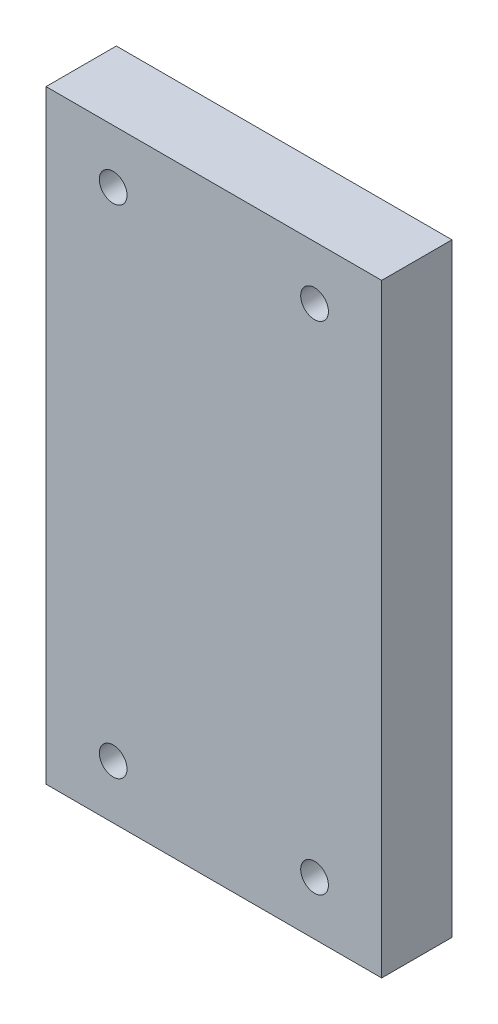
ISO-10303-21;
HEADER;
FILE_DESCRIPTION(('STEP AP214'),'2;1');
FILE_NAME('part.step','',(''),(''),'','','');
FILE_SCHEMA(('AUTOMOTIVE_DESIGN { 1 0 10303 214 1 1 1 1 }'));
ENDSEC;
DATA;
#1=APPLICATION_CONTEXT('core data for automotive mechanical design processes');
#2=APPLICATION_PROTOCOL_DEFINITION('international standard','automotive_design',2000,#1);
#3=PRODUCT_CONTEXT('',#1,'mechanical');
#4=PRODUCT('Part','Part','',(#3));
#5=PRODUCT_RELATED_PRODUCT_CATEGORY('part','',(#4));
#6=PRODUCT_DEFINITION_FORMATION('','',#4);
#7=PRODUCT_DEFINITION_CONTEXT('part definition',#1,'design');
#8=PRODUCT_DEFINITION('design','',#6,#7);
#9=PRODUCT_DEFINITION_SHAPE('','',#8);
#10=(LENGTH_UNIT() NAMED_UNIT(*) SI_UNIT(.MILLI.,.METRE.));
#11=(NAMED_UNIT(*) PLANE_ANGLE_UNIT() SI_UNIT($,.RADIAN.));
#12=(NAMED_UNIT(*) SI_UNIT($,.STERADIAN.) SOLID_ANGLE_UNIT());
#13=UNCERTAINTY_MEASURE_WITH_UNIT(LENGTH_MEASURE(1.E-05),#10,'distance_accuracy_value','');
#14=(GEOMETRIC_REPRESENTATION_CONTEXT(3) GLOBAL_UNCERTAINTY_ASSIGNED_CONTEXT((#13)) GLOBAL_UNIT_ASSIGNED_CONTEXT((#10,
#11,#12)) REPRESENTATION_CONTEXT('',''));
#15=CARTESIAN_POINT('',(0.,0.,0.));
#16=DIRECTION('',(0.,0.,1.));
#17=DIRECTION('',(1.,0.,0.));
#18=AXIS2_PLACEMENT_3D('',#15,#16,#17);
#19=CARTESIAN_POINT('',(0.,90.,10.47));
#20=DIRECTION('',(0.,0.,-1.));
#21=DIRECTION('',(-1.,0.,0.));
#22=AXIS2_PLACEMENT_3D('',#19,#20,#21);
#23=PLANE('',#22);
#24=CARTESIAN_POINT('',(40.,81.9999999999998,10.47));
#25=DIRECTION('',(0.,0.,1.));
#26=DIRECTION('',(1.,0.,0.));
#27=AXIS2_PLACEMENT_3D('',#24,#25,#26);
#28=CIRCLE('',#27,2.065);
#29=CARTESIAN_POINT('',(42.065,81.9999999999998,10.47));
#30=VERTEX_POINT('',#29);
#31=EDGE_CURVE('E123',#30,#30,#28,.T.);
#32=ORIENTED_EDGE('',*,*,#31,.F.);
#33=EDGE_LOOP('',(#32));
#34=FACE_BOUND('',#33,.T.);
#35=CARTESIAN_POINT('',(40.,8.,10.47));
#36=DIRECTION('',(0.,0.,1.));
#37=DIRECTION('',(1.,0.,0.));
#38=AXIS2_PLACEMENT_3D('',#35,#36,#37);
#39=CIRCLE('',#38,2.065);
#40=CARTESIAN_POINT('',(42.065,8.,10.47));
#41=VERTEX_POINT('',#40);
#42=EDGE_CURVE('E102',#41,#41,#39,.T.);
#43=ORIENTED_EDGE('',*,*,#42,.F.);
#44=EDGE_LOOP('',(#43));
#45=FACE_BOUND('',#44,.T.);
#46=DIRECTION('',(0.,-1.,0.));
#47=VECTOR('',#46,1.);
#48=CARTESIAN_POINT('',(0.,0.,10.47));
#49=LINE('',#48,#47);
#50=CARTESIAN_POINT('',(0.,90.,10.47));
#51=VERTEX_POINT('',#50);
#52=CARTESIAN_POINT('',(0.,0.,10.47));
#53=VERTEX_POINT('',#52);
#54=EDGE_CURVE('E87',#51,#53,#49,.T.);
#55=ORIENTED_EDGE('',*,*,#54,.T.);
#56=DIRECTION('',(1.,0.,0.));
#57=VECTOR('',#56,1.);
#58=CARTESIAN_POINT('',(0.,0.,10.47));
#59=LINE('',#58,#57);
#60=CARTESIAN_POINT('',(50.,0.,10.47));
#61=VERTEX_POINT('',#60);
#62=EDGE_CURVE('E82',#53,#61,#59,.T.);
#63=ORIENTED_EDGE('',*,*,#62,.T.);
#64=DIRECTION('',(0.,1.,0.));
#65=VECTOR('',#64,1.);
#66=CARTESIAN_POINT('',(50.,0.,10.47));
#67=LINE('',#66,#65);
#68=CARTESIAN_POINT('',(50.,90.,10.47));
#69=VERTEX_POINT('',#68);
#70=EDGE_CURVE('E85',#61,#69,#67,.T.);
#71=ORIENTED_EDGE('',*,*,#70,.T.);
#72=DIRECTION('',(-1.,0.,0.));
#73=VECTOR('',#72,1.);
#74=CARTESIAN_POINT('',(0.,90.,10.47));
#75=LINE('',#74,#73);
#76=EDGE_CURVE('E52',#69,#51,#75,.T.);
#77=ORIENTED_EDGE('',*,*,#76,.T.);
#78=EDGE_LOOP('',(#55,#63,#71,#77));
#79=FACE_BOUND('',#78,.T.);
#80=CARTESIAN_POINT('',(10.,8.,10.47));
#81=DIRECTION('',(0.,0.,1.));
#82=DIRECTION('',(1.,0.,0.));
#83=AXIS2_PLACEMENT_3D('',#80,#81,#82);
#84=CIRCLE('',#83,2.065);
#85=CARTESIAN_POINT('',(12.065,8.,10.47));
#86=VERTEX_POINT('',#85);
#87=EDGE_CURVE('E117',#86,#86,#84,.T.);
#88=ORIENTED_EDGE('',*,*,#87,.F.);
#89=EDGE_LOOP('',(#88));
#90=FACE_BOUND('',#89,.T.);
#91=CARTESIAN_POINT('',(10.,81.9999999999998,10.47));
#92=DIRECTION('',(0.,0.,1.));
#93=DIRECTION('',(1.,0.,0.));
#94=AXIS2_PLACEMENT_3D('',#91,#92,#93);
#95=CIRCLE('',#94,2.065);
#96=CARTESIAN_POINT('',(12.065,81.9999999999998,10.47));
#97=VERTEX_POINT('',#96);
#98=EDGE_CURVE('E129',#97,#97,#95,.T.);
#99=ORIENTED_EDGE('',*,*,#98,.F.);
#100=EDGE_LOOP('',(#99));
#101=FACE_BOUND('',#100,.T.);
#102=ADVANCED_FACE('F35',(#34,#45,#79,#90,#101),#23,.F.);
#103=CARTESIAN_POINT('',(0.,90.,0.));
#104=DIRECTION('',(0.,0.,-1.));
#105=DIRECTION('',(-1.,0.,0.));
#106=AXIS2_PLACEMENT_3D('',#103,#104,#105);
#107=PLANE('',#106);
#108=CARTESIAN_POINT('',(40.,81.9999999999998,0.));
#109=DIRECTION('',(0.,0.,1.));
#110=DIRECTION('',(1.,0.,0.));
#111=AXIS2_PLACEMENT_3D('',#108,#109,#110);
#112=CIRCLE('',#111,2.065);
#113=CARTESIAN_POINT('',(42.065,81.9999999999998,0.));
#114=VERTEX_POINT('',#113);
#115=EDGE_CURVE('E126',#114,#114,#112,.T.);
#116=ORIENTED_EDGE('',*,*,#115,.T.);
#117=EDGE_LOOP('',(#116));
#118=FACE_BOUND('',#117,.T.);
#119=CARTESIAN_POINT('',(40.,8.,0.));
#120=DIRECTION('',(0.,0.,1.));
#121=DIRECTION('',(1.,0.,0.));
#122=AXIS2_PLACEMENT_3D('',#119,#120,#121);
#123=CIRCLE('',#122,2.065);
#124=CARTESIAN_POINT('',(42.065,8.,0.));
#125=VERTEX_POINT('',#124);
#126=EDGE_CURVE('E114',#125,#125,#123,.T.);
#127=ORIENTED_EDGE('',*,*,#126,.T.);
#128=EDGE_LOOP('',(#127));
#129=FACE_BOUND('',#128,.T.);
#130=DIRECTION('',(0.,-1.,0.));
#131=VECTOR('',#130,1.);
#132=CARTESIAN_POINT('',(0.,0.,0.));
#133=LINE('',#132,#131);
#134=CARTESIAN_POINT('',(0.,90.,0.));
#135=VERTEX_POINT('',#134);
#136=CARTESIAN_POINT('',(0.,0.,0.));
#137=VERTEX_POINT('',#136);
#138=EDGE_CURVE('E99',#135,#137,#133,.T.);
#139=ORIENTED_EDGE('',*,*,#138,.F.);
#140=DIRECTION('',(-1.,0.,0.));
#141=VECTOR('',#140,1.);
#142=CARTESIAN_POINT('',(0.,90.,0.));
#143=LINE('',#142,#141);
#144=CARTESIAN_POINT('',(50.,90.,0.));
#145=VERTEX_POINT('',#144);
#146=EDGE_CURVE('E75',#145,#135,#143,.T.);
#147=ORIENTED_EDGE('',*,*,#146,.F.);
#148=DIRECTION('',(0.,1.,0.));
#149=VECTOR('',#148,1.);
#150=CARTESIAN_POINT('',(50.,0.,0.));
#151=LINE('',#150,#149);
#152=CARTESIAN_POINT('',(50.,0.,0.));
#153=VERTEX_POINT('',#152);
#154=EDGE_CURVE('E69',#153,#145,#151,.T.);
#155=ORIENTED_EDGE('',*,*,#154,.F.);
#156=DIRECTION('',(1.,0.,0.));
#157=VECTOR('',#156,1.);
#158=CARTESIAN_POINT('',(0.,0.,0.));
#159=LINE('',#158,#157);
#160=EDGE_CURVE('E91',#137,#153,#159,.T.);
#161=ORIENTED_EDGE('',*,*,#160,.F.);
#162=EDGE_LOOP('',(#139,#147,#155,#161));
#163=FACE_BOUND('',#162,.T.);
#164=CARTESIAN_POINT('',(10.,8.,0.));
#165=DIRECTION('',(0.,0.,1.));
#166=DIRECTION('',(1.,0.,0.));
#167=AXIS2_PLACEMENT_3D('',#164,#165,#166);
#168=CIRCLE('',#167,2.065);
#169=CARTESIAN_POINT('',(12.065,8.,0.));
#170=VERTEX_POINT('',#169);
#171=EDGE_CURVE('E120',#170,#170,#168,.T.);
#172=ORIENTED_EDGE('',*,*,#171,.T.);
#173=EDGE_LOOP('',(#172));
#174=FACE_BOUND('',#173,.T.);
#175=CARTESIAN_POINT('',(10.,81.9999999999998,0.));
#176=DIRECTION('',(0.,0.,1.));
#177=DIRECTION('',(1.,0.,0.));
#178=AXIS2_PLACEMENT_3D('',#175,#176,#177);
#179=CIRCLE('',#178,2.065);
#180=CARTESIAN_POINT('',(12.065,81.9999999999998,0.));
#181=VERTEX_POINT('',#180);
#182=EDGE_CURVE('E132',#181,#181,#179,.T.);
#183=ORIENTED_EDGE('',*,*,#182,.T.);
#184=EDGE_LOOP('',(#183));
#185=FACE_BOUND('',#184,.T.);
#186=ADVANCED_FACE('F110',(#118,#129,#163,#174,#185),#107,.T.);
#187=CARTESIAN_POINT('',(0.,0.,10.47));
#188=DIRECTION('',(1.,0.,0.));
#189=DIRECTION('',(0.,0.,-1.));
#190=AXIS2_PLACEMENT_3D('',#187,#188,#189);
#191=PLANE('',#190);
#192=ORIENTED_EDGE('',*,*,#138,.T.);
#193=DIRECTION('',(0.,0.,-1.));
#194=VECTOR('',#193,1.);
#195=CARTESIAN_POINT('',(0.,0.,10.47));
#196=LINE('',#195,#194);
#197=EDGE_CURVE('E11',#53,#137,#196,.T.);
#198=ORIENTED_EDGE('',*,*,#197,.F.);
#199=ORIENTED_EDGE('',*,*,#54,.F.);
#200=DIRECTION('',(0.,0.,-1.));
#201=VECTOR('',#200,1.);
#202=CARTESIAN_POINT('',(0.,90.,10.47));
#203=LINE('',#202,#201);
#204=EDGE_CURVE('E95',#51,#135,#203,.T.);
#205=ORIENTED_EDGE('',*,*,#204,.T.);
#206=EDGE_LOOP('',(#192,#198,#199,#205));
#207=FACE_BOUND('',#206,.T.);
#208=ADVANCED_FACE('F37',(#207),#191,.F.);
#209=CARTESIAN_POINT('',(0.,0.,10.47));
#210=DIRECTION('',(0.,1.,0.));
#211=DIRECTION('',(0.,0.,1.));
#212=AXIS2_PLACEMENT_3D('',#209,#210,#211);
#213=PLANE('',#212);
#214=ORIENTED_EDGE('',*,*,#160,.T.);
#215=DIRECTION('',(0.,0.,-1.));
#216=VECTOR('',#215,1.);
#217=CARTESIAN_POINT('',(50.,0.,10.47));
#218=LINE('',#217,#216);
#219=EDGE_CURVE('E44',#61,#153,#218,.T.);
#220=ORIENTED_EDGE('',*,*,#219,.F.);
#221=ORIENTED_EDGE('',*,*,#62,.F.);
#222=ORIENTED_EDGE('',*,*,#197,.T.);
#223=EDGE_LOOP('',(#214,#220,#221,#222));
#224=FACE_BOUND('',#223,.T.);
#225=ADVANCED_FACE('F90',(#224),#213,.F.);
#226=CARTESIAN_POINT('',(50.,0.,10.47));
#227=DIRECTION('',(-1.,0.,0.));
#228=DIRECTION('',(0.,0.,1.));
#229=AXIS2_PLACEMENT_3D('',#226,#227,#228);
#230=PLANE('',#229);
#231=ORIENTED_EDGE('',*,*,#154,.T.);
#232=DIRECTION('',(0.,0.,-1.));
#233=VECTOR('',#232,1.);
#234=CARTESIAN_POINT('',(50.,90.,10.47));
#235=LINE('',#234,#233);
#236=EDGE_CURVE('E92',#69,#145,#235,.T.);
#237=ORIENTED_EDGE('',*,*,#236,.F.);
#238=ORIENTED_EDGE('',*,*,#70,.F.);
#239=ORIENTED_EDGE('',*,*,#219,.T.);
#240=EDGE_LOOP('',(#231,#237,#238,#239));
#241=FACE_BOUND('',#240,.T.);
#242=ADVANCED_FACE('F93',(#241),#230,.F.);
#243=CARTESIAN_POINT('',(0.,90.,10.47));
#244=DIRECTION('',(0.,-1.,0.));
#245=DIRECTION('',(0.,0.,-1.));
#246=AXIS2_PLACEMENT_3D('',#243,#244,#245);
#247=PLANE('',#246);
#248=ORIENTED_EDGE('',*,*,#146,.T.);
#249=ORIENTED_EDGE('',*,*,#204,.F.);
#250=ORIENTED_EDGE('',*,*,#76,.F.);
#251=ORIENTED_EDGE('',*,*,#236,.T.);
#252=EDGE_LOOP('',(#248,#249,#250,#251));
#253=FACE_BOUND('',#252,.T.);
#254=ADVANCED_FACE('F107',(#253),#247,.F.);
#255=CARTESIAN_POINT('',(40.,8.,10.47));
#256=DIRECTION('',(0.,0.,-1.));
#257=DIRECTION('',(-1.,0.,0.));
#258=AXIS2_PLACEMENT_3D('',#255,#256,#257);
#259=CYLINDRICAL_SURFACE('',#258,2.065);
#260=ORIENTED_EDGE('',*,*,#42,.T.);
#261=EDGE_LOOP('',(#260));
#262=FACE_BOUND('',#261,.T.);
#263=ORIENTED_EDGE('',*,*,#126,.F.);
#264=EDGE_LOOP('',(#263));
#265=FACE_BOUND('',#264,.T.);
#266=ADVANCED_FACE('F152',(#262,#265),#259,.F.);
#267=CARTESIAN_POINT('',(10.,8.,10.47));
#268=DIRECTION('',(0.,0.,-1.));
#269=DIRECTION('',(-1.,0.,0.));
#270=AXIS2_PLACEMENT_3D('',#267,#268,#269);
#271=CYLINDRICAL_SURFACE('',#270,2.065);
#272=ORIENTED_EDGE('',*,*,#87,.T.);
#273=EDGE_LOOP('',(#272));
#274=FACE_BOUND('',#273,.T.);
#275=ORIENTED_EDGE('',*,*,#171,.F.);
#276=EDGE_LOOP('',(#275));
#277=FACE_BOUND('',#276,.T.);
#278=ADVANCED_FACE('F198',(#274,#277),#271,.F.);
#279=CARTESIAN_POINT('',(40.,81.9999999999998,10.47));
#280=DIRECTION('',(0.,0.,-1.));
#281=DIRECTION('',(-1.,0.,0.));
#282=AXIS2_PLACEMENT_3D('',#279,#280,#281);
#283=CYLINDRICAL_SURFACE('',#282,2.065);
#284=ORIENTED_EDGE('',*,*,#31,.T.);
#285=EDGE_LOOP('',(#284));
#286=FACE_BOUND('',#285,.T.);
#287=ORIENTED_EDGE('',*,*,#115,.F.);
#288=EDGE_LOOP('',(#287));
#289=FACE_BOUND('',#288,.T.);
#290=ADVANCED_FACE('F206',(#286,#289),#283,.F.);
#291=CARTESIAN_POINT('',(10.,81.9999999999998,10.47));
#292=DIRECTION('',(0.,0.,-1.));
#293=DIRECTION('',(-1.,0.,0.));
#294=AXIS2_PLACEMENT_3D('',#291,#292,#293);
#295=CYLINDRICAL_SURFACE('',#294,2.065);
#296=ORIENTED_EDGE('',*,*,#98,.T.);
#297=EDGE_LOOP('',(#296));
#298=FACE_BOUND('',#297,.T.);
#299=ORIENTED_EDGE('',*,*,#182,.F.);
#300=EDGE_LOOP('',(#299));
#301=FACE_BOUND('',#300,.T.);
#302=ADVANCED_FACE('F138',(#298,#301),#295,.F.);
#303=CLOSED_SHELL('',(#102,#186,#208,#225,#242,#254,#266,#278,#290,#302));
#304=MANIFOLD_SOLID_BREP('B2',#303);
#305=ADVANCED_BREP_SHAPE_REPRESENTATION('',(#18,#304),#14);
#306=SHAPE_DEFINITION_REPRESENTATION(#9,#305);
ENDSEC;
END-ISO-10303-21;
